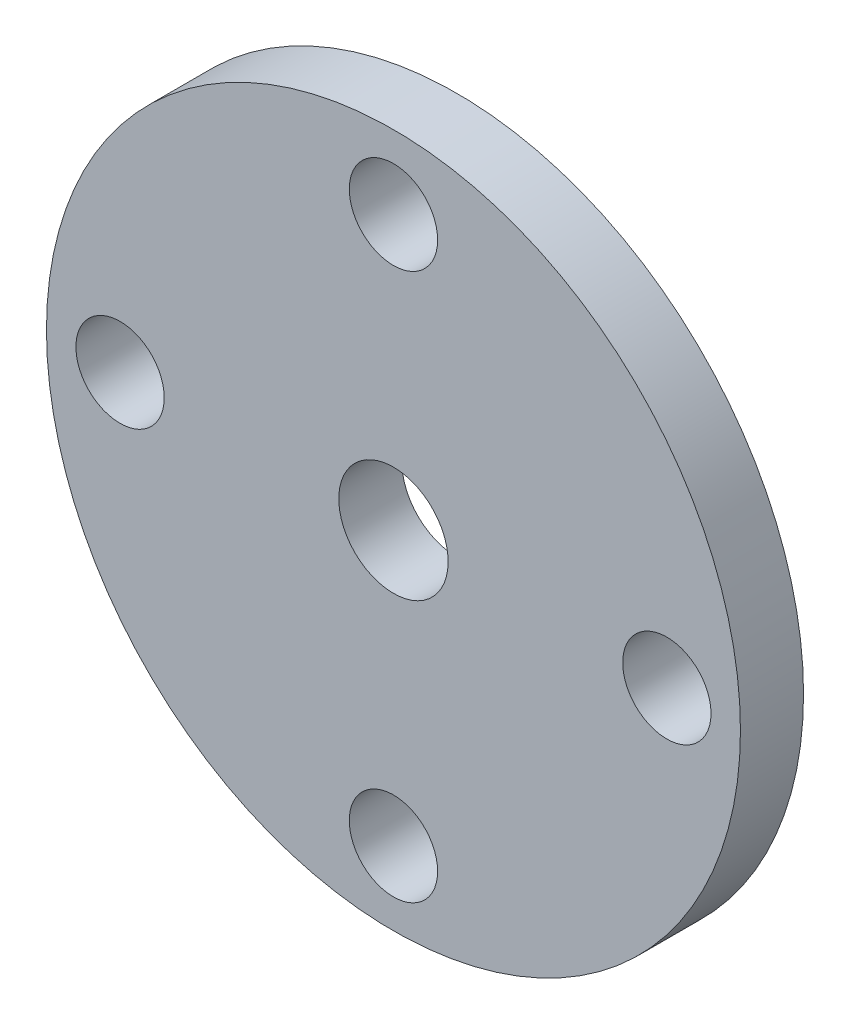
ISO-10303-21;
HEADER;
FILE_DESCRIPTION(('STEP AP214'),'2;1');
FILE_NAME('part.step','',(''),(''),'','','');
FILE_SCHEMA(('AUTOMOTIVE_DESIGN { 1 0 10303 214 1 1 1 1 }'));
ENDSEC;
DATA;
#1=APPLICATION_CONTEXT('core data for automotive mechanical design processes');
#2=APPLICATION_PROTOCOL_DEFINITION('international standard','automotive_design',2000,#1);
#3=PRODUCT_CONTEXT('',#1,'mechanical');
#4=PRODUCT('Part','Part','',(#3));
#5=PRODUCT_RELATED_PRODUCT_CATEGORY('part','',(#4));
#6=PRODUCT_DEFINITION_FORMATION('','',#4);
#7=PRODUCT_DEFINITION_CONTEXT('part definition',#1,'design');
#8=PRODUCT_DEFINITION('design','',#6,#7);
#9=PRODUCT_DEFINITION_SHAPE('','',#8);
#10=(LENGTH_UNIT() NAMED_UNIT(*) SI_UNIT(.MILLI.,.METRE.));
#11=(NAMED_UNIT(*) PLANE_ANGLE_UNIT() SI_UNIT($,.RADIAN.));
#12=(NAMED_UNIT(*) SI_UNIT($,.STERADIAN.) SOLID_ANGLE_UNIT());
#13=UNCERTAINTY_MEASURE_WITH_UNIT(LENGTH_MEASURE(1.E-05),#10,'distance_accuracy_value','');
#14=(GEOMETRIC_REPRESENTATION_CONTEXT(3) GLOBAL_UNCERTAINTY_ASSIGNED_CONTEXT((#13)) GLOBAL_UNIT_ASSIGNED_CONTEXT((#10,
#11,#12)) REPRESENTATION_CONTEXT('',''));
#15=CARTESIAN_POINT('',(0.,0.,0.));
#16=DIRECTION('',(0.,0.,1.));
#17=DIRECTION('',(1.,0.,0.));
#18=AXIS2_PLACEMENT_3D('',#15,#16,#17);
#19=CARTESIAN_POINT('',(0.,0.,3.));
#20=DIRECTION('',(0.,0.,1.));
#21=DIRECTION('',(1.,0.,0.));
#22=AXIS2_PLACEMENT_3D('',#19,#20,#21);
#23=PLANE('',#22);
#24=CARTESIAN_POINT('',(-13.,0.,3.));
#25=DIRECTION('',(0.,0.,1.));
#26=DIRECTION('',(1.,0.,0.));
#27=AXIS2_PLACEMENT_3D('',#24,#25,#26);
#28=CIRCLE('',#27,2.1);
#29=CARTESIAN_POINT('',(-10.9,0.,3.));
#30=VERTEX_POINT('',#29);
#31=EDGE_CURVE('E62',#30,#30,#28,.T.);
#32=ORIENTED_EDGE('',*,*,#31,.F.);
#33=EDGE_LOOP('',(#32));
#34=FACE_BOUND('',#33,.T.);
#35=CARTESIAN_POINT('',(13.,0.,3.));
#36=DIRECTION('',(0.,0.,1.));
#37=DIRECTION('',(1.,0.,0.));
#38=AXIS2_PLACEMENT_3D('',#35,#36,#37);
#39=CIRCLE('',#38,2.1);
#40=CARTESIAN_POINT('',(15.1,0.,3.));
#41=VERTEX_POINT('',#40);
#42=EDGE_CURVE('E50',#41,#41,#39,.T.);
#43=ORIENTED_EDGE('',*,*,#42,.F.);
#44=EDGE_LOOP('',(#43));
#45=FACE_BOUND('',#44,.T.);
#46=CARTESIAN_POINT('',(0.,0.,3.));
#47=DIRECTION('',(0.,0.,1.));
#48=DIRECTION('',(1.,0.,0.));
#49=AXIS2_PLACEMENT_3D('',#46,#47,#48);
#50=CIRCLE('',#49,16.5);
#51=CARTESIAN_POINT('',(16.5,0.,3.));
#52=VERTEX_POINT('',#51);
#53=EDGE_CURVE('E10',#52,#52,#50,.T.);
#54=ORIENTED_EDGE('',*,*,#53,.T.);
#55=EDGE_LOOP('',(#54));
#56=FACE_BOUND('',#55,.T.);
#57=CARTESIAN_POINT('',(0.,13.,3.));
#58=DIRECTION('',(0.,0.,1.));
#59=DIRECTION('',(1.,0.,0.));
#60=AXIS2_PLACEMENT_3D('',#57,#58,#59);
#61=CIRCLE('',#60,2.1);
#62=CARTESIAN_POINT('',(2.1,13.,3.));
#63=VERTEX_POINT('',#62);
#64=EDGE_CURVE('E45',#63,#63,#61,.T.);
#65=ORIENTED_EDGE('',*,*,#64,.F.);
#66=EDGE_LOOP('',(#65));
#67=FACE_BOUND('',#66,.T.);
#68=CARTESIAN_POINT('',(0.,-13.,3.));
#69=DIRECTION('',(0.,0.,1.));
#70=DIRECTION('',(1.,0.,0.));
#71=AXIS2_PLACEMENT_3D('',#68,#69,#70);
#72=CIRCLE('',#71,2.1);
#73=CARTESIAN_POINT('',(2.1,-13.,3.));
#74=VERTEX_POINT('',#73);
#75=EDGE_CURVE('E56',#74,#74,#72,.T.);
#76=ORIENTED_EDGE('',*,*,#75,.F.);
#77=EDGE_LOOP('',(#76));
#78=FACE_BOUND('',#77,.T.);
#79=CARTESIAN_POINT('',(0.,0.,3.));
#80=DIRECTION('',(0.,0.,1.));
#81=DIRECTION('',(1.,0.,0.));
#82=AXIS2_PLACEMENT_3D('',#79,#80,#81);
#83=CIRCLE('',#82,2.6);
#84=CARTESIAN_POINT('',(2.6,0.,3.));
#85=VERTEX_POINT('',#84);
#86=EDGE_CURVE('E68',#85,#85,#83,.T.);
#87=ORIENTED_EDGE('',*,*,#86,.F.);
#88=EDGE_LOOP('',(#87));
#89=FACE_BOUND('',#88,.T.);
#90=ADVANCED_FACE('F34',(#34,#45,#56,#67,#78,#89),#23,.T.);
#91=CARTESIAN_POINT('',(0.,0.,0.));
#92=DIRECTION('',(0.,0.,1.));
#93=DIRECTION('',(1.,0.,0.));
#94=AXIS2_PLACEMENT_3D('',#91,#92,#93);
#95=PLANE('',#94);
#96=CARTESIAN_POINT('',(0.,0.,0.));
#97=DIRECTION('',(0.,0.,1.));
#98=DIRECTION('',(1.,0.,0.));
#99=AXIS2_PLACEMENT_3D('',#96,#97,#98);
#100=CIRCLE('',#99,16.5);
#101=CARTESIAN_POINT('',(16.5,0.,0.));
#102=VERTEX_POINT('',#101);
#103=EDGE_CURVE('E38',#102,#102,#100,.T.);
#104=ORIENTED_EDGE('',*,*,#103,.F.);
#105=EDGE_LOOP('',(#104));
#106=FACE_BOUND('',#105,.T.);
#107=CARTESIAN_POINT('',(0.,13.,0.));
#108=DIRECTION('',(0.,0.,1.));
#109=DIRECTION('',(1.,0.,0.));
#110=AXIS2_PLACEMENT_3D('',#107,#108,#109);
#111=CIRCLE('',#110,2.1);
#112=CARTESIAN_POINT('',(2.1,13.,0.));
#113=VERTEX_POINT('',#112);
#114=EDGE_CURVE('E47',#113,#113,#111,.T.);
#115=ORIENTED_EDGE('',*,*,#114,.T.);
#116=EDGE_LOOP('',(#115));
#117=FACE_BOUND('',#116,.T.);
#118=CARTESIAN_POINT('',(13.,0.,0.));
#119=DIRECTION('',(0.,0.,1.));
#120=DIRECTION('',(1.,0.,0.));
#121=AXIS2_PLACEMENT_3D('',#118,#119,#120);
#122=CIRCLE('',#121,2.1);
#123=CARTESIAN_POINT('',(15.1,0.,0.));
#124=VERTEX_POINT('',#123);
#125=EDGE_CURVE('E53',#124,#124,#122,.T.);
#126=ORIENTED_EDGE('',*,*,#125,.T.);
#127=EDGE_LOOP('',(#126));
#128=FACE_BOUND('',#127,.T.);
#129=CARTESIAN_POINT('',(0.,-13.,0.));
#130=DIRECTION('',(0.,0.,1.));
#131=DIRECTION('',(1.,0.,0.));
#132=AXIS2_PLACEMENT_3D('',#129,#130,#131);
#133=CIRCLE('',#132,2.1);
#134=CARTESIAN_POINT('',(2.1,-13.,0.));
#135=VERTEX_POINT('',#134);
#136=EDGE_CURVE('E59',#135,#135,#133,.T.);
#137=ORIENTED_EDGE('',*,*,#136,.T.);
#138=EDGE_LOOP('',(#137));
#139=FACE_BOUND('',#138,.T.);
#140=CARTESIAN_POINT('',(-13.,0.,0.));
#141=DIRECTION('',(0.,0.,1.));
#142=DIRECTION('',(1.,0.,0.));
#143=AXIS2_PLACEMENT_3D('',#140,#141,#142);
#144=CIRCLE('',#143,2.1);
#145=CARTESIAN_POINT('',(-10.9,0.,0.));
#146=VERTEX_POINT('',#145);
#147=EDGE_CURVE('E65',#146,#146,#144,.T.);
#148=ORIENTED_EDGE('',*,*,#147,.T.);
#149=EDGE_LOOP('',(#148));
#150=FACE_BOUND('',#149,.T.);
#151=CARTESIAN_POINT('',(0.,0.,0.));
#152=DIRECTION('',(0.,0.,1.));
#153=DIRECTION('',(1.,0.,0.));
#154=AXIS2_PLACEMENT_3D('',#151,#152,#153);
#155=CIRCLE('',#154,2.6);
#156=CARTESIAN_POINT('',(2.6,0.,0.));
#157=VERTEX_POINT('',#156);
#158=EDGE_CURVE('E71',#157,#157,#155,.T.);
#159=ORIENTED_EDGE('',*,*,#158,.T.);
#160=EDGE_LOOP('',(#159));
#161=FACE_BOUND('',#160,.T.);
#162=ADVANCED_FACE('F81',(#106,#117,#128,#139,#150,#161),#95,.F.);
#163=CARTESIAN_POINT('',(0.,0.,3.));
#164=DIRECTION('',(0.,0.,-1.));
#165=DIRECTION('',(-1.,0.,0.));
#166=AXIS2_PLACEMENT_3D('',#163,#164,#165);
#167=CYLINDRICAL_SURFACE('',#166,16.5);
#168=ORIENTED_EDGE('',*,*,#53,.F.);
#169=EDGE_LOOP('',(#168));
#170=FACE_BOUND('',#169,.T.);
#171=ORIENTED_EDGE('',*,*,#103,.T.);
#172=EDGE_LOOP('',(#171));
#173=FACE_BOUND('',#172,.T.);
#174=ADVANCED_FACE('F36',(#170,#173),#167,.T.);
#175=CARTESIAN_POINT('',(0.,13.,3.));
#176=DIRECTION('',(0.,0.,-1.));
#177=DIRECTION('',(-1.,0.,0.));
#178=AXIS2_PLACEMENT_3D('',#175,#176,#177);
#179=CYLINDRICAL_SURFACE('',#178,2.1);
#180=ORIENTED_EDGE('',*,*,#64,.T.);
#181=EDGE_LOOP('',(#180));
#182=FACE_BOUND('',#181,.T.);
#183=ORIENTED_EDGE('',*,*,#114,.F.);
#184=EDGE_LOOP('',(#183));
#185=FACE_BOUND('',#184,.T.);
#186=ADVANCED_FACE('F91',(#182,#185),#179,.F.);
#187=CARTESIAN_POINT('',(13.,0.,3.));
#188=DIRECTION('',(0.,0.,-1.));
#189=DIRECTION('',(-1.,0.,0.));
#190=AXIS2_PLACEMENT_3D('',#187,#188,#189);
#191=CYLINDRICAL_SURFACE('',#190,2.1);
#192=ORIENTED_EDGE('',*,*,#42,.T.);
#193=EDGE_LOOP('',(#192));
#194=FACE_BOUND('',#193,.T.);
#195=ORIENTED_EDGE('',*,*,#125,.F.);
#196=EDGE_LOOP('',(#195));
#197=FACE_BOUND('',#196,.T.);
#198=ADVANCED_FACE('F94',(#194,#197),#191,.F.);
#199=CARTESIAN_POINT('',(0.,-13.,3.));
#200=DIRECTION('',(0.,0.,-1.));
#201=DIRECTION('',(-1.,0.,0.));
#202=AXIS2_PLACEMENT_3D('',#199,#200,#201);
#203=CYLINDRICAL_SURFACE('',#202,2.1);
#204=ORIENTED_EDGE('',*,*,#75,.T.);
#205=EDGE_LOOP('',(#204));
#206=FACE_BOUND('',#205,.T.);
#207=ORIENTED_EDGE('',*,*,#136,.F.);
#208=EDGE_LOOP('',(#207));
#209=FACE_BOUND('',#208,.T.);
#210=ADVANCED_FACE('F98',(#206,#209),#203,.F.);
#211=CARTESIAN_POINT('',(-13.,0.,3.));
#212=DIRECTION('',(0.,0.,-1.));
#213=DIRECTION('',(-1.,0.,0.));
#214=AXIS2_PLACEMENT_3D('',#211,#212,#213);
#215=CYLINDRICAL_SURFACE('',#214,2.1);
#216=ORIENTED_EDGE('',*,*,#31,.T.);
#217=EDGE_LOOP('',(#216));
#218=FACE_BOUND('',#217,.T.);
#219=ORIENTED_EDGE('',*,*,#147,.F.);
#220=EDGE_LOOP('',(#219));
#221=FACE_BOUND('',#220,.T.);
#222=ADVANCED_FACE('F102',(#218,#221),#215,.F.);
#223=CARTESIAN_POINT('',(0.,0.,3.));
#224=DIRECTION('',(0.,0.,-1.));
#225=DIRECTION('',(-1.,0.,0.));
#226=AXIS2_PLACEMENT_3D('',#223,#224,#225);
#227=CYLINDRICAL_SURFACE('',#226,2.6);
#228=ORIENTED_EDGE('',*,*,#86,.T.);
#229=EDGE_LOOP('',(#228));
#230=FACE_BOUND('',#229,.T.);
#231=ORIENTED_EDGE('',*,*,#158,.F.);
#232=EDGE_LOOP('',(#231));
#233=FACE_BOUND('',#232,.T.);
#234=ADVANCED_FACE('F77',(#230,#233),#227,.F.);
#235=CLOSED_SHELL('',(#90,#162,#174,#186,#198,#210,#222,#234));
#236=MANIFOLD_SOLID_BREP('B2',#235);
#237=ADVANCED_BREP_SHAPE_REPRESENTATION('',(#18,#236),#14);
#238=SHAPE_DEFINITION_REPRESENTATION(#9,#237);
ENDSEC;
END-ISO-10303-21;
